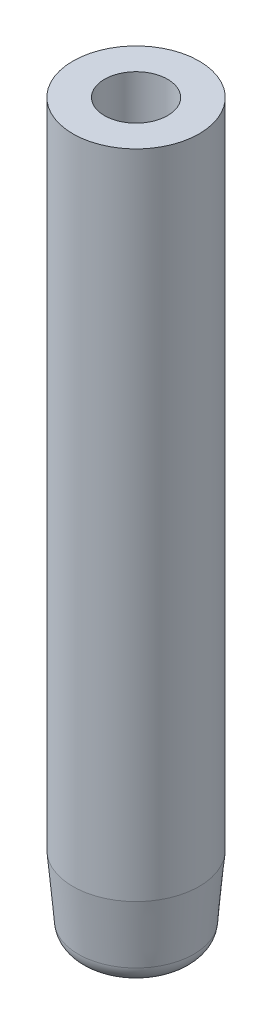
ISO-10303-21;
HEADER;
FILE_DESCRIPTION(('STEP AP214'),'2;1');
FILE_NAME('part.step','',(''),(''),'','','');
FILE_SCHEMA(('AUTOMOTIVE_DESIGN { 1 0 10303 214 1 1 1 1 }'));
ENDSEC;
DATA;
#1=APPLICATION_CONTEXT('core data for automotive mechanical design processes');
#2=APPLICATION_PROTOCOL_DEFINITION('international standard','automotive_design',2000,#1);
#3=PRODUCT_CONTEXT('',#1,'mechanical');
#4=PRODUCT('Part','Part','',(#3));
#5=PRODUCT_RELATED_PRODUCT_CATEGORY('part','',(#4));
#6=PRODUCT_DEFINITION_FORMATION('','',#4);
#7=PRODUCT_DEFINITION_CONTEXT('part definition',#1,'design');
#8=PRODUCT_DEFINITION('design','',#6,#7);
#9=PRODUCT_DEFINITION_SHAPE('','',#8);
#10=(LENGTH_UNIT() NAMED_UNIT(*) SI_UNIT(.MILLI.,.METRE.));
#11=(NAMED_UNIT(*) PLANE_ANGLE_UNIT() SI_UNIT($,.RADIAN.));
#12=(NAMED_UNIT(*) SI_UNIT($,.STERADIAN.) SOLID_ANGLE_UNIT());
#13=UNCERTAINTY_MEASURE_WITH_UNIT(LENGTH_MEASURE(1.E-05),#10,'distance_accuracy_value','');
#14=(GEOMETRIC_REPRESENTATION_CONTEXT(3) GLOBAL_UNCERTAINTY_ASSIGNED_CONTEXT((#13)) GLOBAL_UNIT_ASSIGNED_CONTEXT((#10,
#11,#12)) REPRESENTATION_CONTEXT('',''));
#15=CARTESIAN_POINT('',(0.,0.,0.));
#16=DIRECTION('',(0.,0.,1.));
#17=DIRECTION('',(1.,0.,0.));
#18=AXIS2_PLACEMENT_3D('',#15,#16,#17);
#19=CARTESIAN_POINT('',(0.,65.6,0.));
#20=DIRECTION('',(0.,-1.,0.));
#21=DIRECTION('',(0.,0.,-1.));
#22=AXIS2_PLACEMENT_3D('',#19,#20,#21);
#23=CYLINDRICAL_SURFACE('',#22,6.35);
#24=CARTESIAN_POINT('',(0.,65.6,0.));
#25=DIRECTION('',(0.,1.,0.));
#26=DIRECTION('',(0.,0.,1.));
#27=AXIS2_PLACEMENT_3D('',#24,#25,#26);
#28=CIRCLE('',#27,6.35);
#29=CARTESIAN_POINT('',(0.,65.6,6.35));
#30=VERTEX_POINT('',#29);
#31=EDGE_CURVE('E47',#30,#30,#28,.T.);
#32=ORIENTED_EDGE('',*,*,#31,.F.);
#33=EDGE_LOOP('',(#32));
#34=FACE_BOUND('',#33,.T.);
#35=CARTESIAN_POINT('',(0.,0.,0.));
#36=DIRECTION('',(0.,-1.,0.));
#37=DIRECTION('',(0.,0.,-1.));
#38=AXIS2_PLACEMENT_3D('',#35,#36,#37);
#39=CIRCLE('',#38,6.35);
#40=CARTESIAN_POINT('',(0.,0.,-6.35));
#41=VERTEX_POINT('',#40);
#42=EDGE_CURVE('E56',#41,#41,#39,.T.);
#43=ORIENTED_EDGE('',*,*,#42,.F.);
#44=EDGE_LOOP('',(#43));
#45=FACE_BOUND('',#44,.T.);
#46=ADVANCED_FACE('F31',(#34,#45),#23,.T.);
#47=CARTESIAN_POINT('',(0.,65.6,0.));
#48=DIRECTION('',(0.,1.,0.));
#49=DIRECTION('',(0.,0.,1.));
#50=AXIS2_PLACEMENT_3D('',#47,#48,#49);
#51=PLANE('',#50);
#52=CARTESIAN_POINT('',(0.,65.6,0.));
#53=DIRECTION('',(0.,1.,0.));
#54=DIRECTION('',(0.,0.,1.));
#55=AXIS2_PLACEMENT_3D('',#52,#53,#54);
#56=CIRCLE('',#55,3.175);
#57=CARTESIAN_POINT('',(0.,65.6,3.175));
#58=VERTEX_POINT('',#57);
#59=EDGE_CURVE('E53',#58,#58,#56,.T.);
#60=ORIENTED_EDGE('',*,*,#59,.F.);
#61=EDGE_LOOP('',(#60));
#62=FACE_BOUND('',#61,.T.);
#63=ORIENTED_EDGE('',*,*,#31,.T.);
#64=EDGE_LOOP('',(#63));
#65=FACE_BOUND('',#64,.T.);
#66=ADVANCED_FACE('F84',(#62,#65),#51,.T.);
#67=CARTESIAN_POINT('',(0.,5.59999999999999,0.));
#68=DIRECTION('',(0.,1.,0.));
#69=DIRECTION('',(0.,0.,1.));
#70=AXIS2_PLACEMENT_3D('',#67,#68,#69);
#71=CYLINDRICAL_SURFACE('',#70,3.175);
#72=CARTESIAN_POINT('',(0.,5.59999999999999,0.));
#73=DIRECTION('',(0.,1.,0.));
#74=DIRECTION('',(0.,0.,1.));
#75=AXIS2_PLACEMENT_3D('',#72,#73,#74);
#76=CIRCLE('',#75,3.175);
#77=CARTESIAN_POINT('',(0.,5.59999999999999,3.175));
#78=VERTEX_POINT('',#77);
#79=EDGE_CURVE('E52',#78,#78,#76,.T.);
#80=ORIENTED_EDGE('',*,*,#79,.F.);
#81=EDGE_LOOP('',(#80));
#82=FACE_BOUND('',#81,.T.);
#83=ORIENTED_EDGE('',*,*,#59,.T.);
#84=EDGE_LOOP('',(#83));
#85=FACE_BOUND('',#84,.T.);
#86=ADVANCED_FACE('F89',(#82,#85),#71,.F.);
#87=CARTESIAN_POINT('',(0.,5.59999999999999,0.));
#88=DIRECTION('',(0.,1.,0.));
#89=DIRECTION('',(0.,0.,1.));
#90=AXIS2_PLACEMENT_3D('',#87,#88,#89);
#91=PLANE('',#90);
#92=ORIENTED_EDGE('',*,*,#79,.T.);
#93=EDGE_LOOP('',(#92));
#94=FACE_BOUND('',#93,.T.);
#95=ADVANCED_FACE('F97',(#94),#91,.T.);
#96=CARTESIAN_POINT('',(0.,0.,0.));
#97=DIRECTION('',(0.,1.,0.));
#98=DIRECTION('',(0.,0.,-1.));
#99=AXIS2_PLACEMENT_3D('',#96,#97,#98);
#100=CONICAL_SURFACE('',#99,6.35,0.0872664625997165);
#101=CARTESIAN_POINT('',(-0.27616431548062,-5.41681323258357,-5.86959708102803));
#102=CARTESIAN_POINT('',(-0.252754178683921,-5.43232242667249,-5.86933995481933));
#103=CARTESIAN_POINT('',(-0.228017708585248,-5.44586602954937,-5.86917699619514));
#104=CARTESIAN_POINT('',(-0.176602205477097,-5.4686189227822,-5.86895763793487));
#105=CARTESIAN_POINT('',(-0.149920989015936,-5.47782325192695,-5.8689013600489));
#106=CARTESIAN_POINT('',(-0.0954020203211848,-5.49161814474321,-5.8688334815568));
#107=CARTESIAN_POINT('',(-0.0675648113542268,-5.49621085068853,-5.86882186019891));
#108=CARTESIAN_POINT('',(-0.0115216695387416,-5.50065690810671,-5.86881044296391));
#109=CARTESIAN_POINT('',(0.0166841752358306,-5.50051137166638,-5.86881064431196));
#110=CARTESIAN_POINT('',(0.0726785001174274,-5.49548778108529,-5.86882391612381));
#111=CARTESIAN_POINT('',(0.100466874324642,-5.49060854606424,-5.86883698979879));
#112=CARTESIAN_POINT('',(0.154831079321107,-5.47625388203317,-5.86891081524763));
#113=CARTESIAN_POINT('',(0.181406862689455,-5.46677827344061,-5.86897156888443));
#114=CARTESIAN_POINT('',(0.232588641129019,-5.44350065239548,-5.86920434306464));
#115=CARTESIAN_POINT('',(0.257194745678032,-5.42969888060765,-5.86937635741917));
#116=CARTESIAN_POINT('',(0.303739330662303,-5.39816159193611,-5.86991479213503));
#117=CARTESIAN_POINT('',(0.325677828137619,-5.38042610018213,-5.87028121125445));
#118=CARTESIAN_POINT('',(0.366250161644872,-5.34154042070962,-5.87129837565666));
#119=CARTESIAN_POINT('',(0.384886107273561,-5.32039242943711,-5.87194893850776));
#120=CARTESIAN_POINT('',(0.418341368754775,-5.27527998200552,-5.87361728595911));
#121=CARTESIAN_POINT('',(0.433160747825794,-5.25131557250783,-5.87463506447604));
#122=CARTESIAN_POINT('',(0.458549625922309,-5.20129089074806,-5.87709785294293));
#123=CARTESIAN_POINT('',(0.469124457882476,-5.17523329814463,-5.87854232280088));
#124=CARTESIAN_POINT('',(0.485760308231623,-5.12174327238528,-5.88188683954224));
#125=CARTESIAN_POINT('',(0.491821328950345,-5.09431083993897,-5.88378688619051));
#126=CARTESIAN_POINT('',(0.499276273773625,-5.03882646748797,-5.88803070269155));
#127=CARTESIAN_POINT('',(0.500665743114348,-5.01077396182316,-5.8903748938295));
#128=CARTESIAN_POINT('',(0.498743764377391,-4.95486564903843,-5.89544674757419));
#129=CARTESIAN_POINT('',(0.495432159544947,-4.92700984850865,-5.89817442296526));
#130=CARTESIAN_POINT('',(0.484184483226313,-4.87211392519872,-5.90392727746645));
#131=CARTESIAN_POINT('',(0.476222315419202,-4.84507931841937,-5.90695405468822));
#132=CARTESIAN_POINT('',(0.455885938292568,-4.79274088731823,-5.91315086143792));
#133=CARTESIAN_POINT('',(0.44351150963535,-4.76743714911411,-5.91632089808058));
#134=CARTESIAN_POINT('',(0.414599519398403,-4.71909863994187,-5.9226567640994));
#135=CARTESIAN_POINT('',(0.398034916287426,-4.69608001401633,-5.9258224264225));
#136=CARTESIAN_POINT('',(0.361241508697293,-4.65315173962996,-5.9319416524037));
#137=CARTESIAN_POINT('',(0.341012672226393,-4.63324211831608,-5.93489521420967));
#138=CARTESIAN_POINT('',(0.297463813219349,-4.59711655094956,-5.94040155279825));
#139=CARTESIAN_POINT('',(0.274145925535407,-4.58089807478744,-5.94295460373733));
#140=CARTESIAN_POINT('',(0.225061322570112,-4.55261930942773,-5.94749144827848));
#141=CARTESIAN_POINT('',(0.199294764169295,-4.54055875407079,-5.94947527831651));
#142=CARTESIAN_POINT('',(0.146332599611814,-4.52106935019345,-5.95271772034779));
#143=CARTESIAN_POINT('',(0.119154954335684,-4.51359294283088,-5.95398376831643));
#144=CARTESIAN_POINT('',(0.0639066429422167,-4.50330561193303,-5.95573301160573));
#145=CARTESIAN_POINT('',(0.03583604719857,-4.50049432166232,-5.95621626846329));
#146=CARTESIAN_POINT('',(-0.0200543430752883,-4.49963016535319,-5.95636441912795));
#147=CARTESIAN_POINT('',(-0.0478732832062271,-4.501522638318,-5.95603871367088));
#148=CARTESIAN_POINT('',(-0.102791360180165,-4.50989243096851,-5.954611741849));
#149=CARTESIAN_POINT('',(-0.12989050757463,-4.51636968340726,-5.95351048685951));
#150=CARTESIAN_POINT('',(-0.182575751656974,-4.53370145733085,-5.95061069275734));
#151=CARTESIAN_POINT('',(-0.20816351424646,-4.54455105218795,-5.94881293852746));
#152=CARTESIAN_POINT('',(-0.257156904639122,-4.57030663847384,-5.94464120855747));
#153=CARTESIAN_POINT('',(-0.280562415872862,-4.58521284642847,-5.94226720206005));
#154=CARTESIAN_POINT('',(-0.324790708467435,-4.61883007154826,-5.93706944477073));
#155=CARTESIAN_POINT('',(-0.345584233572303,-4.63757889192407,-5.93424129111745));
#156=CARTESIAN_POINT('',(-0.383742912042042,-4.67825598569073,-5.92832989599713));
#157=CARTESIAN_POINT('',(-0.401107819530632,-4.70018448691043,-5.92524663625815));
#158=CARTESIAN_POINT('',(-0.432122702981496,-4.74688965910973,-5.91896911731336));
#159=CARTESIAN_POINT('',(-0.445727017423913,-4.77169654968921,-5.91577398318674));
#160=CARTESIAN_POINT('',(-0.468569336706143,-4.82325755559468,-5.90948353321359));
#161=CARTESIAN_POINT('',(-0.477807240317496,-4.8500117160485,-5.90638821968278));
#162=CARTESIAN_POINT('',(-0.491668216452721,-4.90479989736718,-5.90044071231764));
#163=CARTESIAN_POINT('',(-0.496277946404663,-4.93283737634723,-5.8975892429575));
#164=CARTESIAN_POINT('',(-0.500687875151447,-4.98932207725211,-5.89225696362989));
#165=CARTESIAN_POINT('',(-0.500488405252831,-5.01776927081671,-5.88977612814124));
#166=CARTESIAN_POINT('',(-0.495283816305895,-5.07408773782034,-5.88527141174793));
#167=CARTESIAN_POINT('',(-0.490306943427683,-5.10196141322383,-5.88324493132023));
#168=CARTESIAN_POINT('',(-0.475713246508605,-5.15650520472539,-5.87965531637515));
#169=CARTESIAN_POINT('',(-0.466095510308929,-5.18317508309053,-5.87809227304359));
#170=CARTESIAN_POINT('',(-0.442559332884395,-5.23437299728933,-5.87541899283518));
#171=CARTESIAN_POINT('',(-0.42866675161674,-5.25891280408374,-5.87430612395372));
#172=CARTESIAN_POINT('',(-0.396961424582549,-5.30530179834065,-5.87246574505261));
#173=CARTESIAN_POINT('',(-0.379153164494055,-5.32715402030769,-5.87173779730231));
#174=CARTESIAN_POINT('',(-0.347049992146462,-5.3603972573729,-5.87079046940961));
#175=CARTESIAN_POINT('',(-0.333741403873169,-5.37275399363051,-5.87048227864893));
#176=CARTESIAN_POINT('',(-0.305861205116354,-5.39595173847626,-5.86996864907317));
#177=CARTESIAN_POINT('',(-0.291289595705069,-5.40679274835114,-5.86976321017086));
#178=CARTESIAN_POINT('',(-0.27616431548062,-5.41681323258357,-5.86959708102803));
#179=B_SPLINE_CURVE_WITH_KNOTS('',3,(#101,#102,#103,#104,#105,#106,#107,#108,#109,#110,#111,
#112,#113,#114,#115,#116,#117,#118,#119,#120,#121,#122,#123,#124,#125,#126,#127,#128,#129,#130,
#131,#132,#133,#134,#135,#136,#137,#138,#139,#140,#141,#142,#143,#144,#145,#146,#147,#148,#149,
#150,#151,#152,#153,#154,#155,#156,#157,#158,#159,#160,#161,#162,#163,#164,#165,#166,#167,#168,
#169,#170,#171,#172,#173,#174,#175,#176,#177,#178),.UNSPECIFIED.,.T.,.F.,(4,2,2,2,2,2,2,2,2,2,2,
2,2,2,2,2,2,2,2,2,2,2,2,2,2,2,2,2,2,2,2,2,2,2,2,2,2,2,4),(0.,0.0841818404072961,
0.168459696202376,0.252698383600956,0.336917299942924,0.421157231150214,0.505400453917626,
0.589638991060427,0.67387699007868,0.758060984238541,0.842243583865463,0.926320081181672,
1.01039653510293,1.09455314112927,1.17871255337784,1.26334882032645,1.34798929521129,
1.43319059572147,1.51839264014429,1.60353610541629,1.6886741194208,1.77291321344104,
1.85714568492133,1.94040390326596,2.02366090045134,2.10682434721472,2.18999223378228,
2.27402138910828,2.35805656822593,2.44307128262769,2.52808796786703,2.6133490501323,
2.69860425876482,2.78335848494318,2.8681293763018,2.95239721970962,3.03656902686759,
3.0909589271898,3.14534878133836),.UNSPECIFIED.);
#180=CARTESIAN_POINT('',(-0.27616431548062,-5.41681323258357,-5.86959708102803));
#181=VERTEX_POINT('',#180);
#182=EDGE_CURVE('E35',#181,#181,#179,.T.);
#183=ORIENTED_EDGE('',*,*,#182,.T.);
#184=EDGE_LOOP('',(#183));
#185=FACE_BOUND('',#184,.T.);
#186=CARTESIAN_POINT('',(0.,-6.17431148549532,0.));
#187=DIRECTION('',(0.,1.,0.));
#188=DIRECTION('',(0.,0.,1.));
#189=AXIS2_PLACEMENT_3D('',#186,#187,#188);
#190=CIRCLE('',#189,5.80981773994125);
#191=CARTESIAN_POINT('',(0.,-6.17431148549532,5.80981773994125));
#192=VERTEX_POINT('',#191);
#193=EDGE_CURVE('E10',#192,#192,#190,.T.);
#194=ORIENTED_EDGE('',*,*,#193,.T.);
#195=EDGE_LOOP('',(#194));
#196=FACE_BOUND('',#195,.T.);
#197=ORIENTED_EDGE('',*,*,#42,.T.);
#198=EDGE_LOOP('',(#197));
#199=FACE_BOUND('',#198,.T.);
#200=ADVANCED_FACE('F68',(#185,#196,#199),#100,.T.);
#201=CARTESIAN_POINT('',(0.,-8.,0.));
#202=DIRECTION('',(0.,-1.,0.));
#203=DIRECTION('',(0.,0.,-1.));
#204=AXIS2_PLACEMENT_3D('',#201,#202,#203);
#205=PLANE('',#204);
#206=CARTESIAN_POINT('',(0.,-8.,0.));
#207=DIRECTION('',(0.,-1.,0.));
#208=DIRECTION('',(0.,0.,-1.));
#209=AXIS2_PLACEMENT_3D('',#206,#207,#208);
#210=CIRCLE('',#209,3.81742834375776);
#211=CARTESIAN_POINT('',(0.,-8.,-3.81742834375776));
#212=VERTEX_POINT('',#211);
#213=EDGE_CURVE('E43',#212,#212,#210,.T.);
#214=ORIENTED_EDGE('',*,*,#213,.T.);
#215=EDGE_LOOP('',(#214));
#216=FACE_BOUND('',#215,.T.);
#217=ADVANCED_FACE('F79',(#216),#205,.T.);
#218=CARTESIAN_POINT('',(0.,-6.,0.));
#219=DIRECTION('',(0.,-1.,0.));
#220=DIRECTION('',(0.,0.,-1.));
#221=AXIS2_PLACEMENT_3D('',#218,#219,#220);
#222=TOROIDAL_SURFACE('',#221,3.81742834375776,2.);
#223=ORIENTED_EDGE('',*,*,#193,.F.);
#224=EDGE_LOOP('',(#223));
#225=FACE_BOUND('',#224,.T.);
#226=ORIENTED_EDGE('',*,*,#213,.F.);
#227=EDGE_LOOP('',(#226));
#228=FACE_BOUND('',#227,.T.);
#229=ADVANCED_FACE('F33',(#225,#228),#222,.T.);
#230=CARTESIAN_POINT('',(0.,-5.,-8.));
#231=DIRECTION('',(0.,0.,1.));
#232=DIRECTION('',(1.,0.,0.));
#233=AXIS2_PLACEMENT_3D('',#230,#231,#232);
#234=CYLINDRICAL_SURFACE('',#233,0.5);
#235=CARTESIAN_POINT('',(0.,-5.,0.));
#236=DIRECTION('',(0.,0.,1.));
#237=DIRECTION('',(1.,0.,0.));
#238=AXIS2_PLACEMENT_3D('',#235,#236,#237);
#239=CIRCLE('',#238,0.5);
#240=CARTESIAN_POINT('',(0.5,-5.,0.));
#241=VERTEX_POINT('',#240);
#242=EDGE_CURVE('E61',#241,#241,#239,.T.);
#243=ORIENTED_EDGE('',*,*,#242,.T.);
#244=EDGE_LOOP('',(#243));
#245=FACE_BOUND('',#244,.T.);
#246=ORIENTED_EDGE('',*,*,#182,.F.);
#247=EDGE_LOOP('',(#246));
#248=FACE_BOUND('',#247,.T.);
#249=ADVANCED_FACE('F70',(#245,#248),#234,.F.);
#250=CARTESIAN_POINT('',(0.,-5.,0.));
#251=DIRECTION('',(0.,0.,1.));
#252=DIRECTION('',(1.,0.,0.));
#253=AXIS2_PLACEMENT_3D('',#250,#251,#252);
#254=PLANE('',#253);
#255=ORIENTED_EDGE('',*,*,#242,.F.);
#256=EDGE_LOOP('',(#255));
#257=FACE_BOUND('',#256,.T.);
#258=ADVANCED_FACE('F72',(#257),#254,.F.);
#259=CLOSED_SHELL('',(#46,#66,#86,#95,#200,#217,#229,#249,#258));
#260=MANIFOLD_SOLID_BREP('B2',#259);
#261=ADVANCED_BREP_SHAPE_REPRESENTATION('',(#18,#260),#14);
#262=SHAPE_DEFINITION_REPRESENTATION(#9,#261);
ENDSEC;
END-ISO-10303-21;
